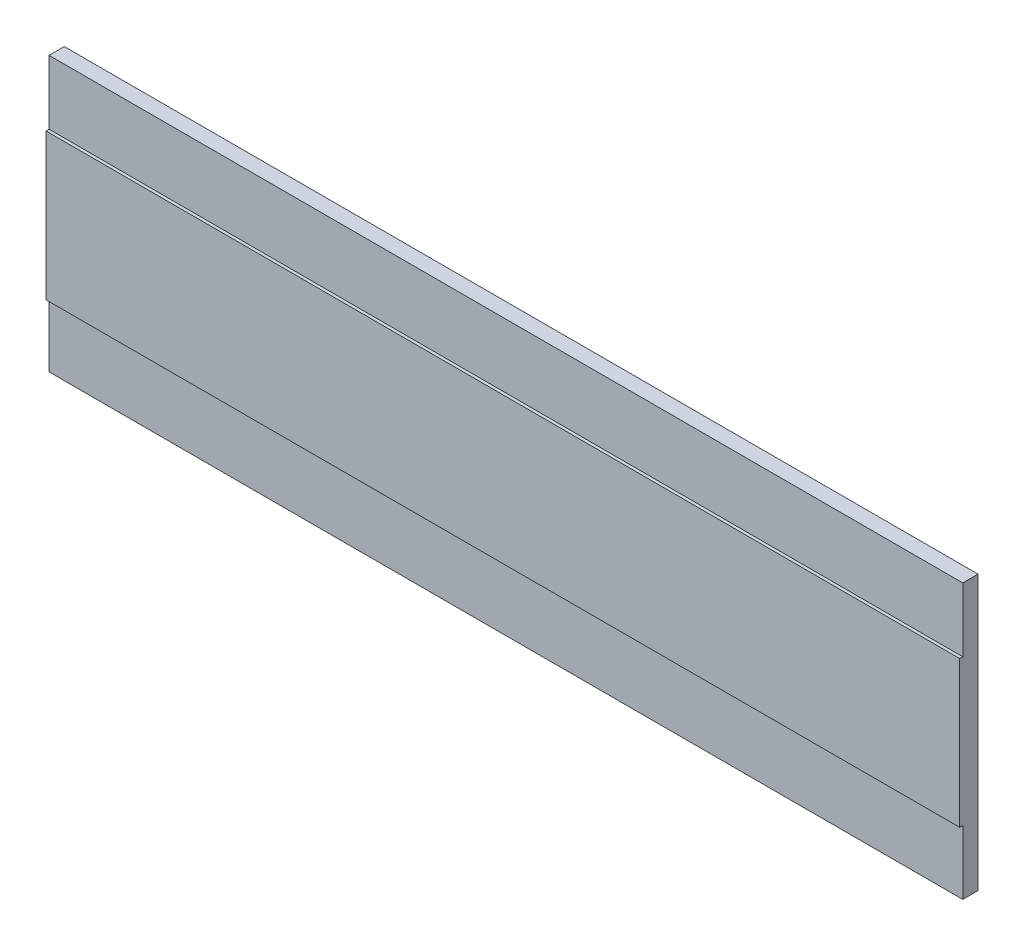
ISO-10303-21;
HEADER;
FILE_DESCRIPTION(('STEP AP214'),'2;1');
FILE_NAME('part.step','',(''),(''),'','','');
FILE_SCHEMA(('AUTOMOTIVE_DESIGN { 1 0 10303 214 1 1 1 1 }'));
ENDSEC;
DATA;
#1=APPLICATION_CONTEXT('core data for automotive mechanical design processes');
#2=APPLICATION_PROTOCOL_DEFINITION('international standard','automotive_design',2000,#1);
#3=PRODUCT_CONTEXT('',#1,'mechanical');
#4=PRODUCT('Part','Part','',(#3));
#5=PRODUCT_RELATED_PRODUCT_CATEGORY('part','',(#4));
#6=PRODUCT_DEFINITION_FORMATION('','',#4);
#7=PRODUCT_DEFINITION_CONTEXT('part definition',#1,'design');
#8=PRODUCT_DEFINITION('design','',#6,#7);
#9=PRODUCT_DEFINITION_SHAPE('','',#8);
#10=(LENGTH_UNIT() NAMED_UNIT(*) SI_UNIT(.MILLI.,.METRE.));
#11=(NAMED_UNIT(*) PLANE_ANGLE_UNIT() SI_UNIT($,.RADIAN.));
#12=(NAMED_UNIT(*) SI_UNIT($,.STERADIAN.) SOLID_ANGLE_UNIT());
#13=UNCERTAINTY_MEASURE_WITH_UNIT(LENGTH_MEASURE(1.E-05),#10,'distance_accuracy_value','');
#14=(GEOMETRIC_REPRESENTATION_CONTEXT(3) GLOBAL_UNCERTAINTY_ASSIGNED_CONTEXT((#13)) GLOBAL_UNIT_ASSIGNED_CONTEXT((#10,
#11,#12)) REPRESENTATION_CONTEXT('',''));
#15=CARTESIAN_POINT('',(0.,0.,0.));
#16=DIRECTION('',(0.,0.,1.));
#17=DIRECTION('',(1.,0.,0.));
#18=AXIS2_PLACEMENT_3D('',#15,#16,#17);
#19=CARTESIAN_POINT('',(0.,270.,10.));
#20=DIRECTION('',(0.,0.,1.));
#21=DIRECTION('',(1.,0.,0.));
#22=AXIS2_PLACEMENT_3D('',#19,#20,#21);
#23=PLANE('',#22);
#24=DIRECTION('',(-1.,0.,0.));
#25=VECTOR('',#24,1.);
#26=CARTESIAN_POINT('',(0.,408.,10.));
#27=LINE('',#26,#25);
#28=CARTESIAN_POINT('',(600.,408.,10.));
#29=VERTEX_POINT('',#28);
#30=CARTESIAN_POINT('',(0.,408.,10.));
#31=VERTEX_POINT('',#30);
#32=EDGE_CURVE('E50',#29,#31,#27,.T.);
#33=ORIENTED_EDGE('',*,*,#32,.F.);
#34=DIRECTION('',(0.,1.,0.));
#35=VECTOR('',#34,1.);
#36=CARTESIAN_POINT('',(600.,450.,10.));
#37=LINE('',#36,#35);
#38=CARTESIAN_POINT('',(600.,450.,10.));
#39=VERTEX_POINT('',#38);
#40=EDGE_CURVE('E171',#29,#39,#37,.T.);
#41=ORIENTED_EDGE('',*,*,#40,.T.);
#42=DIRECTION('',(-1.,0.,0.));
#43=VECTOR('',#42,1.);
#44=CARTESIAN_POINT('',(0.,450.,10.));
#45=LINE('',#44,#43);
#46=CARTESIAN_POINT('',(0.,450.,10.));
#47=VERTEX_POINT('',#46);
#48=EDGE_CURVE('E161',#39,#47,#45,.T.);
#49=ORIENTED_EDGE('',*,*,#48,.T.);
#50=DIRECTION('',(0.,-1.,0.));
#51=VECTOR('',#50,1.);
#52=CARTESIAN_POINT('',(0.,450.,10.));
#53=LINE('',#52,#51);
#54=EDGE_CURVE('E151',#47,#31,#53,.T.);
#55=ORIENTED_EDGE('',*,*,#54,.T.);
#56=EDGE_LOOP('',(#33,#41,#49,#55));
#57=FACE_BOUND('',#56,.T.);
#58=ADVANCED_FACE('F33',(#57),#23,.T.);
#59=CARTESIAN_POINT('',(0.,450.,10.));
#60=DIRECTION('',(1.,0.,0.));
#61=DIRECTION('',(0.,1.,0.));
#62=AXIS2_PLACEMENT_3D('',#59,#60,#61);
#63=PLANE('',#62);
#64=DIRECTION('',(0.,-1.,0.));
#65=VECTOR('',#64,1.);
#66=CARTESIAN_POINT('',(0.,450.,0.));
#67=LINE('',#66,#65);
#68=CARTESIAN_POINT('',(0.,450.,0.));
#69=VERTEX_POINT('',#68);
#70=CARTESIAN_POINT('',(0.,270.,0.));
#71=VERTEX_POINT('',#70);
#72=EDGE_CURVE('E123',#69,#71,#67,.T.);
#73=ORIENTED_EDGE('',*,*,#72,.T.);
#74=DIRECTION('',(0.,0.,-1.));
#75=VECTOR('',#74,1.);
#76=CARTESIAN_POINT('',(0.,270.,10.));
#77=LINE('',#76,#75);
#78=CARTESIAN_POINT('',(0.,270.,10.));
#79=VERTEX_POINT('',#78);
#80=EDGE_CURVE('E11',#79,#71,#77,.T.);
#81=ORIENTED_EDGE('',*,*,#80,.F.);
#82=CARTESIAN_POINT('',(0.,312.,10.));
#83=VERTEX_POINT('',#82);
#84=EDGE_CURVE('E122',#83,#79,#53,.T.);
#85=ORIENTED_EDGE('',*,*,#84,.F.);
#86=DIRECTION('',(0.,0.,-1.));
#87=VECTOR('',#86,1.);
#88=CARTESIAN_POINT('',(0.,312.,12.));
#89=LINE('',#88,#87);
#90=CARTESIAN_POINT('',(0.,312.,12.));
#91=VERTEX_POINT('',#90);
#92=EDGE_CURVE('E104',#91,#83,#89,.T.);
#93=ORIENTED_EDGE('',*,*,#92,.F.);
#94=DIRECTION('',(0.,-1.,0.));
#95=VECTOR('',#94,1.);
#96=CARTESIAN_POINT('',(0.,408.,12.));
#97=LINE('',#96,#95);
#98=CARTESIAN_POINT('',(0.,408.,12.));
#99=VERTEX_POINT('',#98);
#100=EDGE_CURVE('E110',#99,#91,#97,.T.);
#101=ORIENTED_EDGE('',*,*,#100,.F.);
#102=DIRECTION('',(0.,0.,-1.));
#103=VECTOR('',#102,1.);
#104=CARTESIAN_POINT('',(0.,408.,12.));
#105=LINE('',#104,#103);
#106=EDGE_CURVE('E136',#99,#31,#105,.T.);
#107=ORIENTED_EDGE('',*,*,#106,.T.);
#108=ORIENTED_EDGE('',*,*,#54,.F.);
#109=DIRECTION('',(0.,0.,-1.));
#110=VECTOR('',#109,1.);
#111=CARTESIAN_POINT('',(0.,450.,10.));
#112=LINE('',#111,#110);
#113=EDGE_CURVE('E158',#47,#69,#112,.T.);
#114=ORIENTED_EDGE('',*,*,#113,.T.);
#115=EDGE_LOOP('',(#73,#81,#85,#93,#101,#107,#108,#114));
#116=FACE_BOUND('',#115,.T.);
#117=ADVANCED_FACE('F35',(#116),#63,.F.);
#118=CARTESIAN_POINT('',(0.,270.,10.));
#119=DIRECTION('',(0.,1.,0.));
#120=DIRECTION('',(0.,0.,1.));
#121=AXIS2_PLACEMENT_3D('',#118,#119,#120);
#122=PLANE('',#121);
#123=DIRECTION('',(1.,0.,0.));
#124=VECTOR('',#123,1.);
#125=CARTESIAN_POINT('',(0.,270.,0.));
#126=LINE('',#125,#124);
#127=CARTESIAN_POINT('',(600.,270.,0.));
#128=VERTEX_POINT('',#127);
#129=EDGE_CURVE('E125',#71,#128,#126,.T.);
#130=ORIENTED_EDGE('',*,*,#129,.T.);
#131=DIRECTION('',(0.,0.,-1.));
#132=VECTOR('',#131,1.);
#133=CARTESIAN_POINT('',(600.,270.,10.));
#134=LINE('',#133,#132);
#135=CARTESIAN_POINT('',(600.,270.,10.));
#136=VERTEX_POINT('',#135);
#137=EDGE_CURVE('E42',#136,#128,#134,.T.);
#138=ORIENTED_EDGE('',*,*,#137,.F.);
#139=DIRECTION('',(1.,0.,0.));
#140=VECTOR('',#139,1.);
#141=CARTESIAN_POINT('',(0.,270.,10.));
#142=LINE('',#141,#140);
#143=EDGE_CURVE('E145',#79,#136,#142,.T.);
#144=ORIENTED_EDGE('',*,*,#143,.F.);
#145=ORIENTED_EDGE('',*,*,#80,.T.);
#146=EDGE_LOOP('',(#130,#138,#144,#145));
#147=FACE_BOUND('',#146,.T.);
#148=ADVANCED_FACE('F179',(#147),#122,.F.);
#149=CARTESIAN_POINT('',(600.,450.,10.));
#150=DIRECTION('',(-1.,0.,0.));
#151=DIRECTION('',(0.,0.,1.));
#152=AXIS2_PLACEMENT_3D('',#149,#150,#151);
#153=PLANE('',#152);
#154=DIRECTION('',(0.,1.,0.));
#155=VECTOR('',#154,1.);
#156=CARTESIAN_POINT('',(600.,450.,0.));
#157=LINE('',#156,#155);
#158=CARTESIAN_POINT('',(600.,450.,0.));
#159=VERTEX_POINT('',#158);
#160=EDGE_CURVE('E164',#128,#159,#157,.T.);
#161=ORIENTED_EDGE('',*,*,#160,.T.);
#162=DIRECTION('',(0.,0.,-1.));
#163=VECTOR('',#162,1.);
#164=CARTESIAN_POINT('',(600.,450.,10.));
#165=LINE('',#164,#163);
#166=EDGE_CURVE('E155',#39,#159,#165,.T.);
#167=ORIENTED_EDGE('',*,*,#166,.F.);
#168=ORIENTED_EDGE('',*,*,#40,.F.);
#169=DIRECTION('',(0.,0.,-1.));
#170=VECTOR('',#169,1.);
#171=CARTESIAN_POINT('',(600.,408.,12.));
#172=LINE('',#171,#170);
#173=CARTESIAN_POINT('',(600.,408.,12.));
#174=VERTEX_POINT('',#173);
#175=EDGE_CURVE('E127',#174,#29,#172,.T.);
#176=ORIENTED_EDGE('',*,*,#175,.F.);
#177=DIRECTION('',(0.,1.,0.));
#178=VECTOR('',#177,1.);
#179=CARTESIAN_POINT('',(600.,408.,12.));
#180=LINE('',#179,#178);
#181=CARTESIAN_POINT('',(600.,312.,12.));
#182=VERTEX_POINT('',#181);
#183=EDGE_CURVE('E109',#182,#174,#180,.T.);
#184=ORIENTED_EDGE('',*,*,#183,.F.);
#185=DIRECTION('',(0.,0.,-1.));
#186=VECTOR('',#185,1.);
#187=CARTESIAN_POINT('',(600.,312.,12.));
#188=LINE('',#187,#186);
#189=CARTESIAN_POINT('',(600.,312.,10.));
#190=VERTEX_POINT('',#189);
#191=EDGE_CURVE('E106',#182,#190,#188,.T.);
#192=ORIENTED_EDGE('',*,*,#191,.T.);
#193=EDGE_CURVE('E167',#136,#190,#37,.T.);
#194=ORIENTED_EDGE('',*,*,#193,.F.);
#195=ORIENTED_EDGE('',*,*,#137,.T.);
#196=EDGE_LOOP('',(#161,#167,#168,#176,#184,#192,#194,#195));
#197=FACE_BOUND('',#196,.T.);
#198=ADVANCED_FACE('F182',(#197),#153,.F.);
#199=CARTESIAN_POINT('',(0.,450.,10.));
#200=DIRECTION('',(0.,-1.,0.));
#201=DIRECTION('',(0.,0.,-1.));
#202=AXIS2_PLACEMENT_3D('',#199,#200,#201);
#203=PLANE('',#202);
#204=DIRECTION('',(-1.,0.,0.));
#205=VECTOR('',#204,1.);
#206=CARTESIAN_POINT('',(0.,450.,0.));
#207=LINE('',#206,#205);
#208=EDGE_CURVE('E162',#159,#69,#207,.T.);
#209=ORIENTED_EDGE('',*,*,#208,.T.);
#210=ORIENTED_EDGE('',*,*,#113,.F.);
#211=ORIENTED_EDGE('',*,*,#48,.F.);
#212=ORIENTED_EDGE('',*,*,#166,.T.);
#213=EDGE_LOOP('',(#209,#210,#211,#212));
#214=FACE_BOUND('',#213,.T.);
#215=ADVANCED_FACE('F206',(#214),#203,.F.);
#216=DIRECTION('',(1.,0.,0.));
#217=VECTOR('',#216,1.);
#218=CARTESIAN_POINT('',(0.,312.,10.));
#219=LINE('',#218,#217);
#220=EDGE_CURVE('E58',#83,#190,#219,.T.);
#221=ORIENTED_EDGE('',*,*,#220,.F.);
#222=ORIENTED_EDGE('',*,*,#84,.T.);
#223=ORIENTED_EDGE('',*,*,#143,.T.);
#224=ORIENTED_EDGE('',*,*,#193,.T.);
#225=EDGE_LOOP('',(#221,#222,#223,#224));
#226=FACE_BOUND('',#225,.T.);
#227=ADVANCED_FACE('F177',(#226),#23,.T.);
#228=CARTESIAN_POINT('',(0.,270.,0.));
#229=DIRECTION('',(0.,0.,1.));
#230=DIRECTION('',(1.,0.,0.));
#231=AXIS2_PLACEMENT_3D('',#228,#229,#230);
#232=PLANE('',#231);
#233=ORIENTED_EDGE('',*,*,#72,.F.);
#234=ORIENTED_EDGE('',*,*,#208,.F.);
#235=ORIENTED_EDGE('',*,*,#160,.F.);
#236=ORIENTED_EDGE('',*,*,#129,.F.);
#237=EDGE_LOOP('',(#233,#234,#235,#236));
#238=FACE_BOUND('',#237,.T.);
#239=ADVANCED_FACE('F197',(#238),#232,.F.);
#240=CARTESIAN_POINT('',(0.,312.,12.));
#241=DIRECTION('',(0.,1.,0.));
#242=DIRECTION('',(0.,0.,1.));
#243=AXIS2_PLACEMENT_3D('',#240,#241,#242);
#244=PLANE('',#243);
#245=ORIENTED_EDGE('',*,*,#220,.T.);
#246=ORIENTED_EDGE('',*,*,#191,.F.);
#247=DIRECTION('',(1.,0.,0.));
#248=VECTOR('',#247,1.);
#249=CARTESIAN_POINT('',(0.,312.,12.));
#250=LINE('',#249,#248);
#251=EDGE_CURVE('E100',#91,#182,#250,.T.);
#252=ORIENTED_EDGE('',*,*,#251,.F.);
#253=ORIENTED_EDGE('',*,*,#92,.T.);
#254=EDGE_LOOP('',(#245,#246,#252,#253));
#255=FACE_BOUND('',#254,.T.);
#256=ADVANCED_FACE('F102',(#255),#244,.F.);
#257=CARTESIAN_POINT('',(0.,408.,12.));
#258=DIRECTION('',(0.,-1.,0.));
#259=DIRECTION('',(1.,0.,0.));
#260=AXIS2_PLACEMENT_3D('',#257,#258,#259);
#261=PLANE('',#260);
#262=ORIENTED_EDGE('',*,*,#32,.T.);
#263=ORIENTED_EDGE('',*,*,#106,.F.);
#264=DIRECTION('',(-1.,0.,0.));
#265=VECTOR('',#264,1.);
#266=CARTESIAN_POINT('',(0.,408.,12.));
#267=LINE('',#266,#265);
#268=EDGE_CURVE('E115',#174,#99,#267,.T.);
#269=ORIENTED_EDGE('',*,*,#268,.F.);
#270=ORIENTED_EDGE('',*,*,#175,.T.);
#271=EDGE_LOOP('',(#262,#263,#269,#270));
#272=FACE_BOUND('',#271,.T.);
#273=ADVANCED_FACE('F189',(#272),#261,.F.);
#274=CARTESIAN_POINT('',(0.,0.,12.));
#275=DIRECTION('',(0.,0.,1.));
#276=DIRECTION('',(1.,0.,0.));
#277=AXIS2_PLACEMENT_3D('',#274,#275,#276);
#278=PLANE('',#277);
#279=ORIENTED_EDGE('',*,*,#100,.T.);
#280=ORIENTED_EDGE('',*,*,#251,.T.);
#281=ORIENTED_EDGE('',*,*,#183,.T.);
#282=ORIENTED_EDGE('',*,*,#268,.T.);
#283=EDGE_LOOP('',(#279,#280,#281,#282));
#284=FACE_BOUND('',#283,.T.);
#285=ADVANCED_FACE('F113',(#284),#278,.T.);
#286=CLOSED_SHELL('',(#58,#117,#148,#198,#215,#227,#239,#256,#273,#285));
#287=MANIFOLD_SOLID_BREP('B2',#286);
#288=ADVANCED_BREP_SHAPE_REPRESENTATION('',(#18,#287),#14);
#289=SHAPE_DEFINITION_REPRESENTATION(#9,#288);
ENDSEC;
END-ISO-10303-21;
